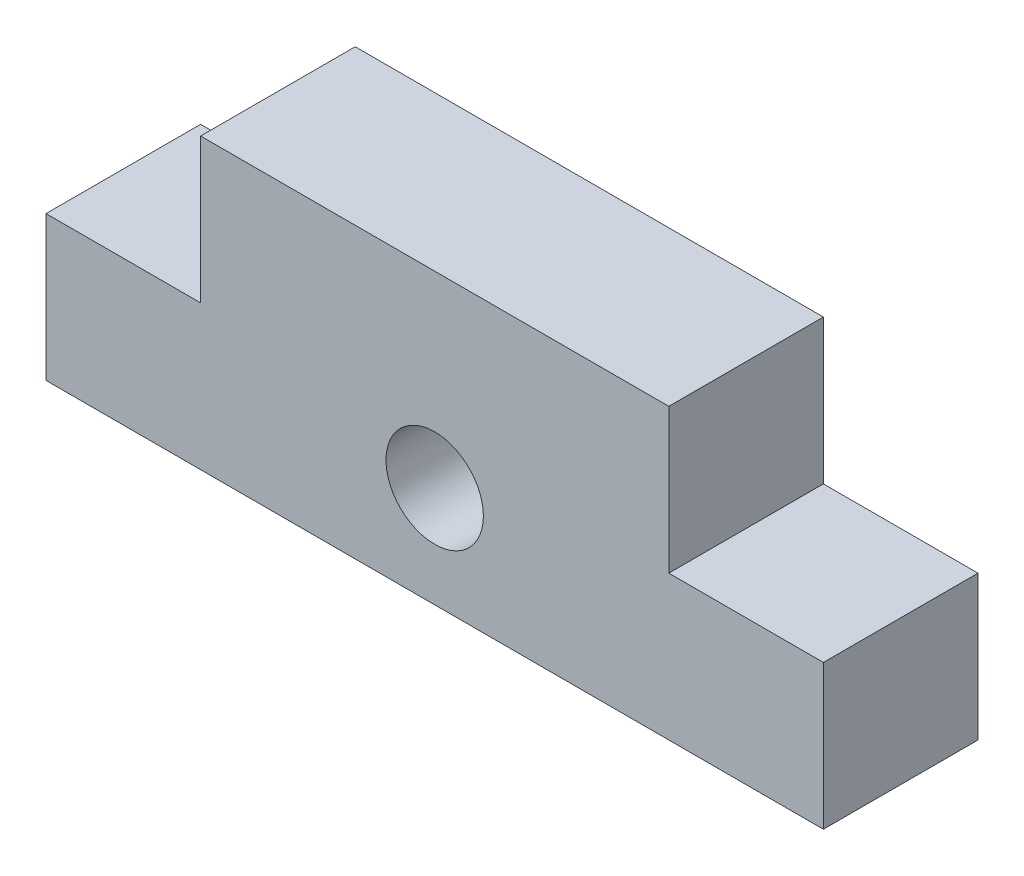
ISO-10303-21;
HEADER;
FILE_DESCRIPTION(('STEP AP214'),'2;1');
FILE_NAME('part.step','',(''),(''),'','','');
FILE_SCHEMA(('AUTOMOTIVE_DESIGN { 1 0 10303 214 1 1 1 1 }'));
ENDSEC;
DATA;
#1=APPLICATION_CONTEXT('core data for automotive mechanical design processes');
#2=APPLICATION_PROTOCOL_DEFINITION('international standard','automotive_design',2000,#1);
#3=PRODUCT_CONTEXT('',#1,'mechanical');
#4=PRODUCT('Part','Part','',(#3));
#5=PRODUCT_RELATED_PRODUCT_CATEGORY('part','',(#4));
#6=PRODUCT_DEFINITION_FORMATION('','',#4);
#7=PRODUCT_DEFINITION_CONTEXT('part definition',#1,'design');
#8=PRODUCT_DEFINITION('design','',#6,#7);
#9=PRODUCT_DEFINITION_SHAPE('','',#8);
#10=(LENGTH_UNIT() NAMED_UNIT(*) SI_UNIT(.MILLI.,.METRE.));
#11=(NAMED_UNIT(*) PLANE_ANGLE_UNIT() SI_UNIT($,.RADIAN.));
#12=(NAMED_UNIT(*) SI_UNIT($,.STERADIAN.) SOLID_ANGLE_UNIT());
#13=UNCERTAINTY_MEASURE_WITH_UNIT(LENGTH_MEASURE(1.E-05),#10,'distance_accuracy_value','');
#14=(GEOMETRIC_REPRESENTATION_CONTEXT(3) GLOBAL_UNCERTAINTY_ASSIGNED_CONTEXT((#13)) GLOBAL_UNIT_ASSIGNED_CONTEXT((#10,
#11,#12)) REPRESENTATION_CONTEXT('',''));
#15=CARTESIAN_POINT('',(0.,0.,0.));
#16=DIRECTION('',(0.,0.,1.));
#17=DIRECTION('',(1.,0.,0.));
#18=AXIS2_PLACEMENT_3D('',#15,#16,#17);
#19=CARTESIAN_POINT('',(0.,0.,5.35));
#20=DIRECTION('',(0.,0.,-1.));
#21=DIRECTION('',(-1.,0.,0.));
#22=AXIS2_PLACEMENT_3D('',#19,#20,#21);
#23=PLANE('',#22);
#24=DIRECTION('',(0.,-1.,0.));
#25=VECTOR('',#24,1.);
#26=CARTESIAN_POINT('',(0.,0.,5.35));
#27=LINE('',#26,#25);
#28=CARTESIAN_POINT('',(0.,5.,5.35));
#29=VERTEX_POINT('',#28);
#30=CARTESIAN_POINT('',(0.,0.,5.35));
#31=VERTEX_POINT('',#30);
#32=EDGE_CURVE('E145',#29,#31,#27,.T.);
#33=ORIENTED_EDGE('',*,*,#32,.T.);
#34=DIRECTION('',(1.,0.,0.));
#35=VECTOR('',#34,1.);
#36=CARTESIAN_POINT('',(0.,0.,5.35));
#37=LINE('',#36,#35);
#38=CARTESIAN_POINT('',(26.9,0.,5.35));
#39=VERTEX_POINT('',#38);
#40=EDGE_CURVE('E93',#31,#39,#37,.T.);
#41=ORIENTED_EDGE('',*,*,#40,.T.);
#42=DIRECTION('',(0.,1.,0.));
#43=VECTOR('',#42,1.);
#44=CARTESIAN_POINT('',(26.9,0.,5.35));
#45=LINE('',#44,#43);
#46=CARTESIAN_POINT('',(26.9,5.,5.35));
#47=VERTEX_POINT('',#46);
#48=EDGE_CURVE('E160',#39,#47,#45,.T.);
#49=ORIENTED_EDGE('',*,*,#48,.T.);
#50=DIRECTION('',(-1.,0.,0.));
#51=VECTOR('',#50,1.);
#52=CARTESIAN_POINT('',(21.55,5.,5.35));
#53=LINE('',#52,#51);
#54=CARTESIAN_POINT('',(21.55,5.,5.35));
#55=VERTEX_POINT('',#54);
#56=EDGE_CURVE('E173',#47,#55,#53,.T.);
#57=ORIENTED_EDGE('',*,*,#56,.T.);
#58=DIRECTION('',(0.,1.,0.));
#59=VECTOR('',#58,1.);
#60=CARTESIAN_POINT('',(21.55,10.,5.35));
#61=LINE('',#60,#59);
#62=CARTESIAN_POINT('',(21.55,10.,5.35));
#63=VERTEX_POINT('',#62);
#64=EDGE_CURVE('E112',#55,#63,#61,.T.);
#65=ORIENTED_EDGE('',*,*,#64,.T.);
#66=DIRECTION('',(-1.,0.,0.));
#67=VECTOR('',#66,1.);
#68=CARTESIAN_POINT('',(5.35,10.,5.35));
#69=LINE('',#68,#67);
#70=CARTESIAN_POINT('',(5.35,10.,5.35));
#71=VERTEX_POINT('',#70);
#72=EDGE_CURVE('E106',#63,#71,#69,.T.);
#73=ORIENTED_EDGE('',*,*,#72,.T.);
#74=DIRECTION('',(0.,-1.,0.));
#75=VECTOR('',#74,1.);
#76=CARTESIAN_POINT('',(5.35,10.,5.35));
#77=LINE('',#76,#75);
#78=CARTESIAN_POINT('',(5.35,5.,5.35));
#79=VERTEX_POINT('',#78);
#80=EDGE_CURVE('E110',#71,#79,#77,.T.);
#81=ORIENTED_EDGE('',*,*,#80,.T.);
#82=DIRECTION('',(-1.,0.,0.));
#83=VECTOR('',#82,1.);
#84=CARTESIAN_POINT('',(0.,5.,5.35));
#85=LINE('',#84,#83);
#86=EDGE_CURVE('E50',#79,#29,#85,.T.);
#87=ORIENTED_EDGE('',*,*,#86,.T.);
#88=EDGE_LOOP('',(#33,#41,#49,#57,#65,#73,#81,#87));
#89=FACE_BOUND('',#88,.T.);
#90=CARTESIAN_POINT('',(13.45,3.5,5.35));
#91=DIRECTION('',(0.,0.,1.));
#92=DIRECTION('',(1.,0.,0.));
#93=AXIS2_PLACEMENT_3D('',#90,#91,#92);
#94=CIRCLE('',#93,1.685);
#95=CARTESIAN_POINT('',(15.135,3.5,5.35));
#96=VERTEX_POINT('',#95);
#97=EDGE_CURVE('E134',#96,#96,#94,.T.);
#98=ORIENTED_EDGE('',*,*,#97,.F.);
#99=EDGE_LOOP('',(#98));
#100=FACE_BOUND('',#99,.T.);
#101=ADVANCED_FACE('F33',(#89,#100),#23,.F.);
#102=CARTESIAN_POINT('',(0.,0.,0.));
#103=DIRECTION('',(0.,0.,-1.));
#104=DIRECTION('',(-1.,0.,0.));
#105=AXIS2_PLACEMENT_3D('',#102,#103,#104);
#106=PLANE('',#105);
#107=DIRECTION('',(0.,-1.,0.));
#108=VECTOR('',#107,1.);
#109=CARTESIAN_POINT('',(0.,0.,0.));
#110=LINE('',#109,#108);
#111=CARTESIAN_POINT('',(0.,5.,0.));
#112=VERTEX_POINT('',#111);
#113=CARTESIAN_POINT('',(0.,0.,0.));
#114=VERTEX_POINT('',#113);
#115=EDGE_CURVE('E130',#112,#114,#110,.T.);
#116=ORIENTED_EDGE('',*,*,#115,.F.);
#117=DIRECTION('',(-1.,0.,0.));
#118=VECTOR('',#117,1.);
#119=CARTESIAN_POINT('',(0.,5.,0.));
#120=LINE('',#119,#118);
#121=CARTESIAN_POINT('',(5.35,5.,0.));
#122=VERTEX_POINT('',#121);
#123=EDGE_CURVE('E85',#122,#112,#120,.T.);
#124=ORIENTED_EDGE('',*,*,#123,.F.);
#125=DIRECTION('',(0.,-1.,0.));
#126=VECTOR('',#125,1.);
#127=CARTESIAN_POINT('',(5.35,10.,0.));
#128=LINE('',#127,#126);
#129=CARTESIAN_POINT('',(5.35,10.,0.));
#130=VERTEX_POINT('',#129);
#131=EDGE_CURVE('E79',#130,#122,#128,.T.);
#132=ORIENTED_EDGE('',*,*,#131,.F.);
#133=DIRECTION('',(-1.,0.,0.));
#134=VECTOR('',#133,1.);
#135=CARTESIAN_POINT('',(5.35,10.,0.));
#136=LINE('',#135,#134);
#137=CARTESIAN_POINT('',(21.55,10.,0.));
#138=VERTEX_POINT('',#137);
#139=EDGE_CURVE('E120',#138,#130,#136,.T.);
#140=ORIENTED_EDGE('',*,*,#139,.F.);
#141=DIRECTION('',(0.,1.,0.));
#142=VECTOR('',#141,1.);
#143=CARTESIAN_POINT('',(21.55,10.,0.));
#144=LINE('',#143,#142);
#145=CARTESIAN_POINT('',(21.55,5.,0.));
#146=VERTEX_POINT('',#145);
#147=EDGE_CURVE('E140',#146,#138,#144,.T.);
#148=ORIENTED_EDGE('',*,*,#147,.F.);
#149=DIRECTION('',(-1.,0.,0.));
#150=VECTOR('',#149,1.);
#151=CARTESIAN_POINT('',(21.55,5.,0.));
#152=LINE('',#151,#150);
#153=CARTESIAN_POINT('',(26.9,5.,0.));
#154=VERTEX_POINT('',#153);
#155=EDGE_CURVE('E138',#154,#146,#152,.T.);
#156=ORIENTED_EDGE('',*,*,#155,.F.);
#157=DIRECTION('',(0.,1.,0.));
#158=VECTOR('',#157,1.);
#159=CARTESIAN_POINT('',(26.9,0.,0.));
#160=LINE('',#159,#158);
#161=CARTESIAN_POINT('',(26.9,0.,0.));
#162=VERTEX_POINT('',#161);
#163=EDGE_CURVE('E136',#162,#154,#160,.T.);
#164=ORIENTED_EDGE('',*,*,#163,.F.);
#165=DIRECTION('',(1.,0.,0.));
#166=VECTOR('',#165,1.);
#167=CARTESIAN_POINT('',(0.,0.,0.));
#168=LINE('',#167,#166);
#169=EDGE_CURVE('E133',#114,#162,#168,.T.);
#170=ORIENTED_EDGE('',*,*,#169,.F.);
#171=EDGE_LOOP('',(#116,#124,#132,#140,#148,#156,#164,#170));
#172=FACE_BOUND('',#171,.T.);
#173=CARTESIAN_POINT('',(13.45,3.5,0.));
#174=DIRECTION('',(0.,0.,1.));
#175=DIRECTION('',(1.,0.,0.));
#176=AXIS2_PLACEMENT_3D('',#173,#174,#175);
#177=CIRCLE('',#176,1.685);
#178=CARTESIAN_POINT('',(15.135,3.5,0.));
#179=VERTEX_POINT('',#178);
#180=EDGE_CURVE('E179',#179,#179,#177,.T.);
#181=ORIENTED_EDGE('',*,*,#180,.T.);
#182=EDGE_LOOP('',(#181));
#183=FACE_BOUND('',#182,.T.);
#184=ADVANCED_FACE('F164',(#172,#183),#106,.T.);
#185=CARTESIAN_POINT('',(0.,0.,5.35));
#186=DIRECTION('',(1.,0.,0.));
#187=DIRECTION('',(0.,0.,-1.));
#188=AXIS2_PLACEMENT_3D('',#185,#186,#187);
#189=PLANE('',#188);
#190=ORIENTED_EDGE('',*,*,#115,.T.);
#191=DIRECTION('',(0.,0.,-1.));
#192=VECTOR('',#191,1.);
#193=CARTESIAN_POINT('',(0.,0.,5.35));
#194=LINE('',#193,#192);
#195=EDGE_CURVE('E11',#31,#114,#194,.T.);
#196=ORIENTED_EDGE('',*,*,#195,.F.);
#197=ORIENTED_EDGE('',*,*,#32,.F.);
#198=DIRECTION('',(0.,0.,-1.));
#199=VECTOR('',#198,1.);
#200=CARTESIAN_POINT('',(0.,5.,5.35));
#201=LINE('',#200,#199);
#202=EDGE_CURVE('E126',#29,#112,#201,.T.);
#203=ORIENTED_EDGE('',*,*,#202,.T.);
#204=EDGE_LOOP('',(#190,#196,#197,#203));
#205=FACE_BOUND('',#204,.T.);
#206=ADVANCED_FACE('F35',(#205),#189,.F.);
#207=CARTESIAN_POINT('',(0.,0.,5.35));
#208=DIRECTION('',(0.,1.,0.));
#209=DIRECTION('',(0.,0.,1.));
#210=AXIS2_PLACEMENT_3D('',#207,#208,#209);
#211=PLANE('',#210);
#212=ORIENTED_EDGE('',*,*,#169,.T.);
#213=DIRECTION('',(0.,0.,-1.));
#214=VECTOR('',#213,1.);
#215=CARTESIAN_POINT('',(26.9,0.,5.35));
#216=LINE('',#215,#214);
#217=EDGE_CURVE('E42',#39,#162,#216,.T.);
#218=ORIENTED_EDGE('',*,*,#217,.F.);
#219=ORIENTED_EDGE('',*,*,#40,.F.);
#220=ORIENTED_EDGE('',*,*,#195,.T.);
#221=EDGE_LOOP('',(#212,#218,#219,#220));
#222=FACE_BOUND('',#221,.T.);
#223=ADVANCED_FACE('F207',(#222),#211,.F.);
#224=CARTESIAN_POINT('',(26.9,0.,5.35));
#225=DIRECTION('',(-1.,0.,0.));
#226=DIRECTION('',(0.,0.,1.));
#227=AXIS2_PLACEMENT_3D('',#224,#225,#226);
#228=PLANE('',#227);
#229=ORIENTED_EDGE('',*,*,#163,.T.);
#230=DIRECTION('',(0.,0.,-1.));
#231=VECTOR('',#230,1.);
#232=CARTESIAN_POINT('',(26.9,5.,5.35));
#233=LINE('',#232,#231);
#234=EDGE_CURVE('E152',#47,#154,#233,.T.);
#235=ORIENTED_EDGE('',*,*,#234,.F.);
#236=ORIENTED_EDGE('',*,*,#48,.F.);
#237=ORIENTED_EDGE('',*,*,#217,.T.);
#238=EDGE_LOOP('',(#229,#235,#236,#237));
#239=FACE_BOUND('',#238,.T.);
#240=ADVANCED_FACE('F158',(#239),#228,.F.);
#241=CARTESIAN_POINT('',(21.55,5.,5.35));
#242=DIRECTION('',(0.,-1.,0.));
#243=DIRECTION('',(0.,0.,-1.));
#244=AXIS2_PLACEMENT_3D('',#241,#242,#243);
#245=PLANE('',#244);
#246=ORIENTED_EDGE('',*,*,#155,.T.);
#247=DIRECTION('',(0.,0.,-1.));
#248=VECTOR('',#247,1.);
#249=CARTESIAN_POINT('',(21.55,5.,5.35));
#250=LINE('',#249,#248);
#251=EDGE_CURVE('E149',#55,#146,#250,.T.);
#252=ORIENTED_EDGE('',*,*,#251,.F.);
#253=ORIENTED_EDGE('',*,*,#56,.F.);
#254=ORIENTED_EDGE('',*,*,#234,.T.);
#255=EDGE_LOOP('',(#246,#252,#253,#254));
#256=FACE_BOUND('',#255,.T.);
#257=ADVANCED_FACE('F169',(#256),#245,.F.);
#258=CARTESIAN_POINT('',(21.55,10.,5.35));
#259=DIRECTION('',(-1.,0.,0.));
#260=DIRECTION('',(0.,0.,1.));
#261=AXIS2_PLACEMENT_3D('',#258,#259,#260);
#262=PLANE('',#261);
#263=ORIENTED_EDGE('',*,*,#147,.T.);
#264=DIRECTION('',(0.,0.,-1.));
#265=VECTOR('',#264,1.);
#266=CARTESIAN_POINT('',(21.55,10.,5.35));
#267=LINE('',#266,#265);
#268=EDGE_CURVE('E121',#63,#138,#267,.T.);
#269=ORIENTED_EDGE('',*,*,#268,.F.);
#270=ORIENTED_EDGE('',*,*,#64,.F.);
#271=ORIENTED_EDGE('',*,*,#251,.T.);
#272=EDGE_LOOP('',(#263,#269,#270,#271));
#273=FACE_BOUND('',#272,.T.);
#274=ADVANCED_FACE('F172',(#273),#262,.F.);
#275=CARTESIAN_POINT('',(5.35,10.,5.35));
#276=DIRECTION('',(0.,-1.,0.));
#277=DIRECTION('',(0.,0.,-1.));
#278=AXIS2_PLACEMENT_3D('',#275,#276,#277);
#279=PLANE('',#278);
#280=ORIENTED_EDGE('',*,*,#139,.T.);
#281=DIRECTION('',(0.,0.,-1.));
#282=VECTOR('',#281,1.);
#283=CARTESIAN_POINT('',(5.35,10.,5.35));
#284=LINE('',#283,#282);
#285=EDGE_CURVE('E117',#71,#130,#284,.T.);
#286=ORIENTED_EDGE('',*,*,#285,.F.);
#287=ORIENTED_EDGE('',*,*,#72,.F.);
#288=ORIENTED_EDGE('',*,*,#268,.T.);
#289=EDGE_LOOP('',(#280,#286,#287,#288));
#290=FACE_BOUND('',#289,.T.);
#291=ADVANCED_FACE('F118',(#290),#279,.F.);
#292=CARTESIAN_POINT('',(5.35,10.,5.35));
#293=DIRECTION('',(1.,0.,0.));
#294=DIRECTION('',(0.,1.,0.));
#295=AXIS2_PLACEMENT_3D('',#292,#293,#294);
#296=PLANE('',#295);
#297=ORIENTED_EDGE('',*,*,#131,.T.);
#298=DIRECTION('',(0.,0.,-1.));
#299=VECTOR('',#298,1.);
#300=CARTESIAN_POINT('',(5.35,5.,5.35));
#301=LINE('',#300,#299);
#302=EDGE_CURVE('E122',#79,#122,#301,.T.);
#303=ORIENTED_EDGE('',*,*,#302,.F.);
#304=ORIENTED_EDGE('',*,*,#80,.F.);
#305=ORIENTED_EDGE('',*,*,#285,.T.);
#306=EDGE_LOOP('',(#297,#303,#304,#305));
#307=FACE_BOUND('',#306,.T.);
#308=ADVANCED_FACE('F124',(#307),#296,.F.);
#309=CARTESIAN_POINT('',(0.,5.,5.35));
#310=DIRECTION('',(0.,-1.,0.));
#311=DIRECTION('',(0.,0.,-1.));
#312=AXIS2_PLACEMENT_3D('',#309,#310,#311);
#313=PLANE('',#312);
#314=ORIENTED_EDGE('',*,*,#123,.T.);
#315=ORIENTED_EDGE('',*,*,#202,.F.);
#316=ORIENTED_EDGE('',*,*,#86,.F.);
#317=ORIENTED_EDGE('',*,*,#302,.T.);
#318=EDGE_LOOP('',(#314,#315,#316,#317));
#319=FACE_BOUND('',#318,.T.);
#320=ADVANCED_FACE('F195',(#319),#313,.F.);
#321=CARTESIAN_POINT('',(13.45,3.5,5.35));
#322=DIRECTION('',(0.,0.,-1.));
#323=DIRECTION('',(-1.,0.,0.));
#324=AXIS2_PLACEMENT_3D('',#321,#322,#323);
#325=CYLINDRICAL_SURFACE('',#324,1.685);
#326=ORIENTED_EDGE('',*,*,#97,.T.);
#327=EDGE_LOOP('',(#326));
#328=FACE_BOUND('',#327,.T.);
#329=ORIENTED_EDGE('',*,*,#180,.F.);
#330=EDGE_LOOP('',(#329));
#331=FACE_BOUND('',#330,.T.);
#332=ADVANCED_FACE('F185',(#328,#331),#325,.F.);
#333=CLOSED_SHELL('',(#101,#184,#206,#223,#240,#257,#274,#291,#308,#320,#332));
#334=MANIFOLD_SOLID_BREP('B2',#333);
#335=ADVANCED_BREP_SHAPE_REPRESENTATION('',(#18,#334),#14);
#336=SHAPE_DEFINITION_REPRESENTATION(#9,#335);
ENDSEC;
END-ISO-10303-21;
